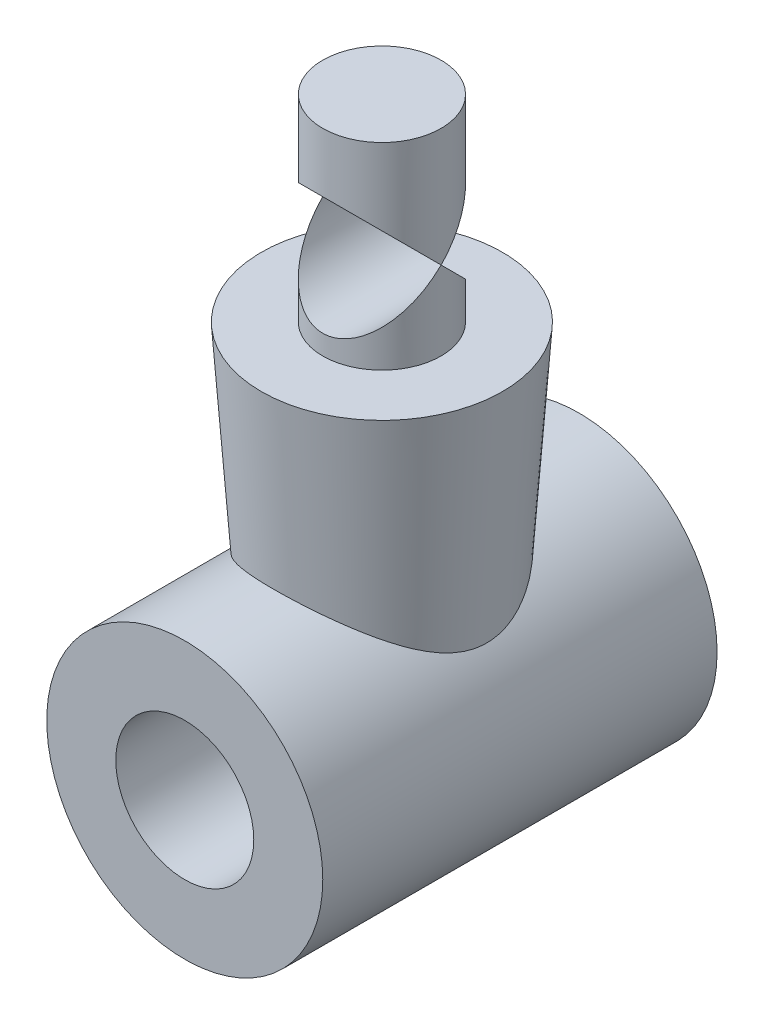
ISO-10303-21;
HEADER;
FILE_DESCRIPTION(('STEP AP214'),'2;1');
FILE_NAME('part.step','',(''),(''),'','','');
FILE_SCHEMA(('AUTOMOTIVE_DESIGN { 1 0 10303 214 1 1 1 1 }'));
ENDSEC;
DATA;
#1=APPLICATION_CONTEXT('core data for automotive mechanical design processes');
#2=APPLICATION_PROTOCOL_DEFINITION('international standard','automotive_design',2000,#1);
#3=PRODUCT_CONTEXT('',#1,'mechanical');
#4=PRODUCT('Part','Part','',(#3));
#5=PRODUCT_RELATED_PRODUCT_CATEGORY('part','',(#4));
#6=PRODUCT_DEFINITION_FORMATION('','',#4);
#7=PRODUCT_DEFINITION_CONTEXT('part definition',#1,'design');
#8=PRODUCT_DEFINITION('design','',#6,#7);
#9=PRODUCT_DEFINITION_SHAPE('','',#8);
#10=(LENGTH_UNIT() NAMED_UNIT(*) SI_UNIT(.MILLI.,.METRE.));
#11=(NAMED_UNIT(*) PLANE_ANGLE_UNIT() SI_UNIT($,.RADIAN.));
#12=(NAMED_UNIT(*) SI_UNIT($,.STERADIAN.) SOLID_ANGLE_UNIT());
#13=UNCERTAINTY_MEASURE_WITH_UNIT(LENGTH_MEASURE(1.E-05),#10,'distance_accuracy_value','');
#14=(GEOMETRIC_REPRESENTATION_CONTEXT(3) GLOBAL_UNCERTAINTY_ASSIGNED_CONTEXT((#13)) GLOBAL_UNIT_ASSIGNED_CONTEXT((#10,
#11,#12)) REPRESENTATION_CONTEXT('',''));
#15=CARTESIAN_POINT('',(0.,0.,0.));
#16=DIRECTION('',(0.,0.,1.));
#17=DIRECTION('',(1.,0.,0.));
#18=AXIS2_PLACEMENT_3D('',#15,#16,#17);
#19=CARTESIAN_POINT('',(0.,80.,0.));
#20=DIRECTION('',(0.,1.,0.));
#21=DIRECTION('',(0.,0.,1.));
#22=AXIS2_PLACEMENT_3D('',#19,#20,#21);
#23=PLANE('',#22);
#24=CARTESIAN_POINT('',(0.,80.,0.));
#25=DIRECTION('',(0.,1.,0.));
#26=DIRECTION('',(0.,0.,1.));
#27=AXIS2_PLACEMENT_3D('',#24,#25,#26);
#28=CIRCLE('',#27,30.5941449554808);
#29=CARTESIAN_POINT('',(0.,80.,30.5941449554808));
#30=VERTEX_POINT('',#29);
#31=EDGE_CURVE('E164',#30,#30,#28,.T.);
#32=ORIENTED_EDGE('',*,*,#31,.T.);
#33=EDGE_LOOP('',(#32));
#34=FACE_BOUND('',#33,.T.);
#35=CARTESIAN_POINT('',(0.,80.,0.));
#36=DIRECTION('',(0.,1.,0.));
#37=DIRECTION('',(0.,0.,1.));
#38=AXIS2_PLACEMENT_3D('',#35,#36,#37);
#39=CIRCLE('',#38,15.);
#40=CARTESIAN_POINT('',(0.,80.,15.));
#41=VERTEX_POINT('',#40);
#42=EDGE_CURVE('E54',#41,#41,#39,.T.);
#43=ORIENTED_EDGE('',*,*,#42,.F.);
#44=EDGE_LOOP('',(#43));
#45=FACE_BOUND('',#44,.T.);
#46=ADVANCED_FACE('F45',(#34,#45),#23,.T.);
#47=CARTESIAN_POINT('',(0.,0.,50.));
#48=DIRECTION('',(0.,0.,-1.));
#49=DIRECTION('',(-1.,0.,0.));
#50=AXIS2_PLACEMENT_3D('',#47,#48,#49);
#51=CYLINDRICAL_SURFACE('',#50,35.);
#52=CARTESIAN_POINT('',(0.,0.,-50.));
#53=DIRECTION('',(0.,0.,1.));
#54=DIRECTION('',(1.,0.,0.));
#55=AXIS2_PLACEMENT_3D('',#52,#53,#54);
#56=CIRCLE('',#55,35.);
#57=CARTESIAN_POINT('',(35.,0.,-50.));
#58=VERTEX_POINT('',#57);
#59=EDGE_CURVE('E78',#58,#58,#56,.T.);
#60=ORIENTED_EDGE('',*,*,#59,.T.);
#61=EDGE_LOOP('',(#60));
#62=FACE_BOUND('',#61,.T.);
#63=CARTESIAN_POINT('',(0.,0.,50.));
#64=DIRECTION('',(0.,0.,1.));
#65=DIRECTION('',(1.,0.,0.));
#66=AXIS2_PLACEMENT_3D('',#63,#64,#65);
#67=CIRCLE('',#66,35.);
#68=CARTESIAN_POINT('',(35.,0.,50.));
#69=VERTEX_POINT('',#68);
#70=EDGE_CURVE('E159',#69,#69,#67,.T.);
#71=ORIENTED_EDGE('',*,*,#70,.F.);
#72=EDGE_LOOP('',(#71));
#73=FACE_BOUND('',#72,.T.);
#74=CARTESIAN_POINT('',(-26.5488905921841,22.8069377235139,-1.56226440722871));
#75=CARTESIAN_POINT('',(-26.5816020897605,22.7688663300843,-0.960928684881653));
#76=CARTESIAN_POINT('',(-26.5954656096954,22.7526119888235,-0.357027043538421));
#77=CARTESIAN_POINT('',(-26.5851282481966,22.7646862271007,0.850093511749713));
#78=CARTESIAN_POINT('',(-26.5609167855964,22.7930271998288,1.45331218927284));
#79=CARTESIAN_POINT('',(-26.4749247824404,22.8928514611434,2.65426582080793));
#80=CARTESIAN_POINT('',(-26.4130924298845,22.9643942468295,3.25199205607547));
#81=CARTESIAN_POINT('',(-26.253118079118,23.1471040016381,4.43632547933198));
#82=CARTESIAN_POINT('',(-26.1549757324716,23.2582713510029,5.02293256056324));
#83=CARTESIAN_POINT('',(-25.9253569328635,23.5139314521459,6.17524217163166));
#84=CARTESIAN_POINT('',(-25.7942482506491,23.6580550361466,6.74110118639965));
#85=CARTESIAN_POINT('',(-25.4999126218233,23.9750118438686,7.85637565409192));
#86=CARTESIAN_POINT('',(-25.3366706445326,24.1478584971835,8.40578327261325));
#87=CARTESIAN_POINT('',(-24.9796294714977,24.5170153091067,9.48690126890832));
#88=CARTESIAN_POINT('',(-24.7858078305209,24.713342676562,10.0185982973177));
#89=CARTESIAN_POINT('',(-24.3691595705759,25.1242854753851,11.0629802848355));
#90=CARTESIAN_POINT('',(-24.146338494398,25.3388974092424,11.5756688531155));
#91=CARTESIAN_POINT('',(-23.5560218784384,25.8910753892501,12.8298234299394));
#92=CARTESIAN_POINT('',(-23.1713409786776,26.2371170285954,13.559532059302));
#93=CARTESIAN_POINT('',(-22.3422481191321,26.9466512458336,14.9753779970905));
#94=CARTESIAN_POINT('',(-21.8978134319206,27.3101504297433,15.6614985798129));
#95=CARTESIAN_POINT('',(-20.9499757601655,28.0438644424219,16.9900326365727));
#96=CARTESIAN_POINT('',(-20.4464731722283,28.4140896984342,17.6323693113153));
#97=CARTESIAN_POINT('',(-19.3820944383247,29.1505279248864,18.8699503871138));
#98=CARTESIAN_POINT('',(-18.8212261684914,29.516741438503,19.465201233062));
#99=CARTESIAN_POINT('',(-17.6379791682679,30.2388137522736,20.6102017667138));
#100=CARTESIAN_POINT('',(-17.0151407491039,30.5945651942643,21.1595456773575));
#101=CARTESIAN_POINT('',(-15.7127945216912,31.283397385232,22.2028508175188));
#102=CARTESIAN_POINT('',(-15.0332788555369,31.6164749789729,22.6968043452146));
#103=CARTESIAN_POINT('',(-13.6212794102822,32.2499191434123,23.6222905304459));
#104=CARTESIAN_POINT('',(-12.8889443728598,32.5503720281072,24.0539889398763));
#105=CARTESIAN_POINT('',(-11.7528310358784,32.9702011338961,24.6504416367821));
#106=CARTESIAN_POINT('',(-11.3679152275488,33.1049855822037,24.8407200812907));
#107=CARTESIAN_POINT('',(-10.5859419036558,33.3632636579013,25.2034856433234));
#108=CARTESIAN_POINT('',(-10.1888815548513,33.4867546233688,25.3759685675884));
#109=CARTESIAN_POINT('',(-9.23148735720225,33.765563109425,25.7637015778327));
#110=CARTESIAN_POINT('',(-8.6660754193532,33.9153085843781,25.9705329846434));
#111=CARTESIAN_POINT('',(-7.516667570741,34.1884272114192,26.3460592718158));
#112=CARTESIAN_POINT('',(-6.93267636941503,34.311806986402,26.5147637300372));
#113=CARTESIAN_POINT('',(-5.74953160924039,34.5297618593752,26.8117972236061));
#114=CARTESIAN_POINT('',(-5.1503861842534,34.6243520688281,26.9401474418135));
#115=CARTESIAN_POINT('',(-3.94053788771621,34.7828168657767,27.154704532018));
#116=CARTESIAN_POINT('',(-3.32983461068292,34.8466903735572,27.2409099225946));
#117=CARTESIAN_POINT('',(-2.09922167653956,34.9424588693151,27.3700259685334));
#118=CARTESIAN_POINT('',(-1.47928759834497,34.9742432380459,27.4127868630959));
#119=CARTESIAN_POINT('',(-0.23713202145856,35.0047100528464,27.4537769796077));
#120=CARTESIAN_POINT('',(0.38508946841538,35.0033926263885,27.4520063730443));
#121=CARTESIAN_POINT('',(1.62690190861612,34.9676863330345,27.4039628889949));
#122=CARTESIAN_POINT('',(2.24649262577538,34.9332945937511,27.3576861463081));
#123=CARTESIAN_POINT('',(3.47815390264036,34.8322300020338,27.221394718994));
#124=CARTESIAN_POINT('',(4.09022460391822,34.765557758272,27.131380859061));
#125=CARTESIAN_POINT('',(5.27214112778017,34.6055243075261,26.9146006884851));
#126=CARTESIAN_POINT('',(5.8425704691514,34.5136599042929,26.7898911024835));
#127=CARTESIAN_POINT('',(6.96925420632147,34.303904339761,26.5039512816503));
#128=CARTESIAN_POINT('',(7.52550918641018,34.1860142532247,26.3427225549144));
#129=CARTESIAN_POINT('',(8.62109998950039,33.9262974984167,25.9856606535141));
#130=CARTESIAN_POINT('',(9.16043363018557,33.7844677576144,25.7898230368263));
#131=CARTESIAN_POINT('',(10.219844942329,33.4792282637885,25.365642300928));
#132=CARTESIAN_POINT('',(10.7399214821734,33.3158172451429,25.1372972752777));
#133=CARTESIAN_POINT('',(11.8075092032836,32.9534515315464,24.6270480509801));
#134=CARTESIAN_POINT('',(12.3529262772655,32.7525945510773,24.3421155914244));
#135=CARTESIAN_POINT('',(13.4168197875949,32.3313526844835,23.7384845569979));
#136=CARTESIAN_POINT('',(13.9352948301803,32.1109667896835,23.4197842378388));
#137=CARTESIAN_POINT('',(14.9443214123162,31.6539747202828,22.7509562338535));
#138=CARTESIAN_POINT('',(15.4348624537116,31.4173625201944,22.4008168593339));
#139=CARTESIAN_POINT('',(16.387093987833,30.931359104639,21.671352252336));
#140=CARTESIAN_POINT('',(16.8487807040885,30.6819662241708,21.2920232139343));
#141=CARTESIAN_POINT('',(17.8319979494327,30.1230836137938,20.4275969597361));
#142=CARTESIAN_POINT('',(18.3470896593566,29.8115312261286,19.9364972676433));
#143=CARTESIAN_POINT('',(19.3344811003469,29.1808345944454,18.9174713689146));
#144=CARTESIAN_POINT('',(19.8067743664586,28.8616892126236,18.3895396198281));
#145=CARTESIAN_POINT('',(20.7085295402389,28.2216721950469,17.2981224950263));
#146=CARTESIAN_POINT('',(21.1379446854277,27.9007990682834,16.7345993734863));
#147=CARTESIAN_POINT('',(21.9526968924284,27.2643766175647,15.5737523812348));
#148=CARTESIAN_POINT('',(22.3380377277558,26.9488268398147,14.976431410753));
#149=CARTESIAN_POINT('',(23.0427182762159,26.3483376190507,13.7841065976734));
#150=CARTESIAN_POINT('',(23.3645831087234,26.0626824534211,13.1909569878838));
#151=CARTESIAN_POINT('',(23.9670048314338,25.5097984171693,11.9756099991335));
#152=CARTESIAN_POINT('',(24.2475585456724,25.242570964093,11.3534103916713));
#153=CARTESIAN_POINT('',(24.7649607156255,24.735153633259,10.0817187142233));
#154=CARTESIAN_POINT('',(25.0018814873965,24.494919280342,9.43227403393749));
#155=CARTESIAN_POINT('',(25.42996949755,24.0501979421391,8.10660505889992));
#156=CARTESIAN_POINT('',(25.6211527274156,23.8456984694201,7.43039022061416));
#157=CARTESIAN_POINT('',(25.9144988724654,23.5260244234644,6.22003344428528));
#158=CARTESIAN_POINT('',(26.0270113987683,23.4012005888792,5.69093721675198));
#159=CARTESIAN_POINT('',(26.2225201112894,23.1819128426803,4.62109600466539));
#160=CARTESIAN_POINT('',(26.3055203929164,23.0874447187855,4.08035264743624));
#161=CARTESIAN_POINT('',(26.4406248655514,22.9325961351776,2.9909543752883));
#162=CARTESIAN_POINT('',(26.4927741318528,22.8721659500908,2.44231220846444));
#163=CARTESIAN_POINT('',(26.5654277869376,22.7877421680704,1.34010668024048));
#164=CARTESIAN_POINT('',(26.585932167997,22.7637485800304,0.786543317639217));
#165=CARTESIAN_POINT('',(26.5949029697388,22.7532677335835,-0.322478244166155));
#166=CARTESIAN_POINT('',(26.5832955858934,22.7668668769053,-0.877937872966779));
#167=CARTESIAN_POINT('',(26.5281168752673,22.8311360030133,-1.98507493957895));
#168=CARTESIAN_POINT('',(26.484545632886,22.8818058879156,-2.53675238737332));
#169=CARTESIAN_POINT('',(26.366166044469,23.0181099620939,-3.63313495128082));
#170=CARTESIAN_POINT('',(26.2913132051506,23.1037939497065,-4.17782899264996));
#171=CARTESIAN_POINT('',(26.1115908824039,23.3067182559876,-5.25624676574789));
#172=CARTESIAN_POINT('',(26.0067172117684,23.4239629765076,-5.78996895602097));
#173=CARTESIAN_POINT('',(25.7326855233964,23.7251303458319,-7.00178524929069));
#174=CARTESIAN_POINT('',(25.5536821303306,23.9185075315634,-7.67531257056482));
#175=CARTESIAN_POINT('',(25.1504071045667,24.3421942325363,-8.9966924603244));
#176=CARTESIAN_POINT('',(24.9261198559698,24.5725164824418,-9.64453607946867));
#177=CARTESIAN_POINT('',(24.4345412746036,25.061394636045,-10.9138027397813));
#178=CARTESIAN_POINT('',(24.1671852591999,25.3199928151676,-11.5351842358192));
#179=CARTESIAN_POINT('',(23.5917451979425,25.8569996881149,-12.7497009201412));
#180=CARTESIAN_POINT('',(23.2836642804603,26.1354068595113,-13.3428382733048));
#181=CARTESIAN_POINT('',(22.6176484073696,26.7140934955255,-14.5190908397184));
#182=CARTESIAN_POINT('',(22.2584312915485,27.0147880933939,-15.1012742941847));
#183=CARTESIAN_POINT('',(21.4991105947089,27.6229051970081,-16.2346282171002));
#184=CARTESIAN_POINT('',(21.0990057987384,27.9303279024622,-16.7857977632354));
#185=CARTESIAN_POINT('',(20.2587251210192,28.5456678230878,-17.855980470573));
#186=CARTESIAN_POINT('',(19.818565476668,28.8535847886068,-18.3750065199443));
#187=CARTESIAN_POINT('',(18.8984872122875,29.4644212737518,-19.3797160469034));
#188=CARTESIAN_POINT('',(18.4185689223488,29.767340834843,-19.8653998012498));
#189=CARTESIAN_POINT('',(17.4059015019265,30.3708962921395,-20.8140731203175));
#190=CARTESIAN_POINT('',(16.8720760523137,30.6712498762944,-21.2760963384346));
#191=CARTESIAN_POINT('',(15.7635779892309,31.2554332682383,-22.1600573091798));
#192=CARTESIAN_POINT('',(15.1889029715765,31.5392621016787,-22.5819926990348));
#193=CARTESIAN_POINT('',(14.0003051378863,32.0845552169558,-23.3819594546026));
#194=CARTESIAN_POINT('',(13.3864094123889,32.3460346502782,-23.7600206274823));
#195=CARTESIAN_POINT('',(12.1210101237122,32.8411692222844,-24.4684283031352));
#196=CARTESIAN_POINT('',(11.4695144431259,33.0748301617053,-24.798784756409));
#197=CARTESIAN_POINT('',(10.2488683075799,33.4708450632298,-25.3541258452596));
#198=CARTESIAN_POINT('',(9.68522328346674,33.6385244720381,-25.5874359134132));
#199=CARTESIAN_POINT('',(8.53675060519238,33.9481581483638,-26.0159362070456));
#200=CARTESIAN_POINT('',(7.95192513258562,34.0901150562698,-26.2111303452458));
#201=CARTESIAN_POINT('',(6.76446432805265,34.3454596218628,-26.5608022641972));
#202=CARTESIAN_POINT('',(6.16183917794292,34.4588632721127,-26.7153028394914));
#203=CARTESIAN_POINT('',(4.94222778097024,34.6548090147215,-26.9814985914549));
#204=CARTESIAN_POINT('',(4.32524137781331,34.7373507710426,-27.0931933020354));
#205=CARTESIAN_POINT('',(3.07858138254592,34.8700009656242,-27.2723952146825));
#206=CARTESIAN_POINT('',(2.44886368349186,34.9199640539143,-27.3397044053007));
#207=CARTESIAN_POINT('',(1.18440093591247,34.9856822717258,-27.4281927432573));
#208=CARTESIAN_POINT('',(0.549655875877318,35.0014373229073,-27.4493717849532));
#209=CARTESIAN_POINT('',(-0.719568302240259,34.9983564608403,-27.4452276710844));
#210=CARTESIAN_POINT('',(-1.35404743018012,34.9795219691632,-27.4199064266024));
#211=CARTESIAN_POINT('',(-2.6175080073499,34.9077211257584,-27.323208663417));
#212=CARTESIAN_POINT('',(-3.24648966632099,34.8547560820025,-27.2518339096041));
#213=CARTESIAN_POINT('',(-4.45042502213632,34.7208100519249,-27.0708071009165));
#214=CARTESIAN_POINT('',(-5.02608506264237,34.6420430289877,-26.9641750910477));
#215=CARTESIAN_POINT('',(-6.16478004279023,34.4576280135958,-26.7136038909342));
#216=CARTESIAN_POINT('',(-6.72781569211197,34.3519815363124,-26.5696668035357));
#217=CARTESIAN_POINT('',(-7.83829978709834,34.1157355271264,-26.2462734804761));
#218=CARTESIAN_POINT('',(-8.38574541009199,33.9851315090977,-26.0668108588803));
#219=CARTESIAN_POINT('',(-9.4624293739641,33.7012235182312,-25.6744097432088));
#220=CARTESIAN_POINT('',(-9.99166665349024,33.5479182249042,-25.4614693017488));
#221=CARTESIAN_POINT('',(-11.0700469715899,33.2083997294529,-24.9865489091726));
#222=CARTESIAN_POINT('',(-11.6175671296448,33.0205589012058,-24.7220507802968));
#223=CARTESIAN_POINT('',(-12.6872372134788,32.6245207761673,-24.1592638871084));
#224=CARTESIAN_POINT('',(-13.2093861575955,32.4163226926508,-23.8609738168041));
#225=CARTESIAN_POINT('',(-14.2269575898941,31.9828002964855,-23.2330663230465));
#226=CARTESIAN_POINT('',(-14.7223815393082,31.7574769218157,-22.9034506151002));
#227=CARTESIAN_POINT('',(-15.6856964326028,31.2928901990526,-22.2150423583723));
#228=CARTESIAN_POINT('',(-16.1535833300471,31.0536248124773,-21.8562455399273));
#229=CARTESIAN_POINT('',(-17.1481428474737,30.5175109275853,-21.0400491357108));
#230=CARTESIAN_POINT('',(-17.6689124576775,30.2184102320418,-20.5769256547329));
#231=CARTESIAN_POINT('',(-18.6698637787223,29.6104568946658,-19.61462066525));
#232=CARTESIAN_POINT('',(-19.150040937742,29.3016031644997,-19.1154351245464));
#233=CARTESIAN_POINT('',(-20.070589439295,28.6789293849691,-18.081602997415));
#234=CARTESIAN_POINT('',(-20.5108490884327,28.3650981223895,-17.5468637512289));
#235=CARTESIAN_POINT('',(-21.3495875020818,27.7393032065627,-16.4445403661447));
#236=CARTESIAN_POINT('',(-21.7480646832621,27.4273396245127,-15.8769549838183));
#237=CARTESIAN_POINT('',(-22.5728739457443,26.7544151207659,-14.6009325819323));
#238=CARTESIAN_POINT('',(-22.99055160463,26.3951610947339,-13.8859624290604));
#239=CARTESIAN_POINT('',(-23.7641527060033,25.7008812202643,-12.4115552240225));
#240=CARTESIAN_POINT('',(-24.1200487386867,25.3658661638426,-11.6520986339934));
#241=CARTESIAN_POINT('',(-24.7650313473991,24.7365184992145,-10.0935555809752));
#242=CARTESIAN_POINT('',(-25.0544176303596,24.4420058914471,-9.29466742254534));
#243=CARTESIAN_POINT('',(-25.5633471054844,23.9092287606385,-7.65756394885426));
#244=CARTESIAN_POINT('',(-25.782977377062,23.6708942047834,-6.81939917695627));
#245=CARTESIAN_POINT('',(-26.1170540138489,23.3013163716932,-5.24948422878493));
#246=CARTESIAN_POINT('',(-26.2428454802296,23.1589185247911,-4.52283610541396));
#247=CARTESIAN_POINT('',(-26.3895369639053,22.9912517977678,-3.42052279160714));
#248=CARTESIAN_POINT('',(-26.4314370546112,22.943015217297,-3.05098832666767));
#249=CARTESIAN_POINT('',(-26.5009508253775,22.8626865384255,-2.3087216189123));
#250=CARTESIAN_POINT('',(-26.5285607229752,22.8305987144916,-1.93598855597412));
#251=CARTESIAN_POINT('',(-26.5488905921841,22.8069377235139,-1.56226440722871));
#252=B_SPLINE_CURVE_WITH_KNOTS('',3,(#74,#75,#76,#77,#78,#79,#80,#81,#82,#83,#84,#85,#86,#87,
#88,#89,#90,#91,#92,#93,#94,#95,#96,#97,#98,#99,#100,#101,#102,#103,#104,#105,#106,#107,#108,
#109,#110,#111,#112,#113,#114,#115,#116,#117,#118,#119,#120,#121,#122,#123,#124,#125,#126,#127,
#128,#129,#130,#131,#132,#133,#134,#135,#136,#137,#138,#139,#140,#141,#142,#143,#144,#145,#146,
#147,#148,#149,#150,#151,#152,#153,#154,#155,#156,#157,#158,#159,#160,#161,#162,#163,#164,#165,
#166,#167,#168,#169,#170,#171,#172,#173,#174,#175,#176,#177,#178,#179,#180,#181,#182,#183,#184,
#185,#186,#187,#188,#189,#190,#191,#192,#193,#194,#195,#196,#197,#198,#199,#200,#201,#202,#203,
#204,#205,#206,#207,#208,#209,#210,#211,#212,#213,#214,#215,#216,#217,#218,#219,#220,#221,#222,
#223,#224,#225,#226,#227,#228,#229,#230,#231,#232,#233,#234,#235,#236,#237,#238,#239,#240,#241,
#242,#243,#244,#245,#246,#247,#248,#249,#250,#251),.UNSPECIFIED.,.T.,.F.,(4,2,2,2,2,2,2,2,2,2,2,
2,2,2,2,2,2,2,2,2,2,2,2,2,2,2,2,2,2,2,2,2,2,2,2,2,2,2,2,2,2,2,2,2,2,2,2,2,2,2,2,2,2,2,2,2,2,2,2,
2,2,2,2,2,2,2,2,2,2,2,2,2,2,2,2,2,2,2,2,2,2,2,2,2,2,2,2,2,4),(0.,1.8098320160308,
3.6201670793949,5.43300102211055,7.24585236147776,9.03931338007425,10.833615310593,
12.6292404246862,14.4245228356563,17.1044654888185,19.7854303604093,22.4709828169244,
25.1561670489828,27.8630118036951,30.5702324693842,33.2701066438809,34.6196620229754,
35.9695346826128,37.8287277750356,39.6874532996689,41.5452015016388,43.4030150000852,
45.2672111981545,47.1314002173487,48.9957511493966,50.8600669291438,52.6314087129183,
54.402677360638,56.1741735146008,57.9457736031255,59.885842060459,61.8260107814791,
63.7669039086796,65.7080505313803,68.036493566056,70.365287741369,72.69659455712,
75.0277016234436,77.2243291380971,79.4211254395685,81.6142474044241,83.8066014509382,
85.4704784157284,87.1341243944197,88.7953336387758,90.4565432886075,92.121574173044,
93.7866006610414,95.454003498318,97.1216390128914,99.2880757643206,101.455260879995,
103.625731648638,105.796035784651,108.035955838902,110.275942470346,112.515025069079,
114.754089080008,117.053586764842,119.353219897888,121.651281450202,123.948862966242,
125.844939441619,127.740821176281,129.635638661288,131.530476777304,133.433711911307,
135.336951403904,137.240112678351,139.143201023028,140.913432154286,142.683563521262,
144.454013369731,146.224566242311,148.131961386916,150.039430273739,151.946794760694,
153.854438829403,156.127428583989,158.400672882386,160.680093386253,162.95960023672,
165.66403553139,168.369667616148,171.06285744745,173.752671918579,176.001184999722,
177.125680041558,178.250472573296),.UNSPECIFIED.);
#253=CARTESIAN_POINT('',(-26.5488905921841,22.8069377235139,-1.56226440722871));
#254=VERTEX_POINT('',#253);
#255=EDGE_CURVE('E64',#254,#254,#252,.T.);
#256=ORIENTED_EDGE('',*,*,#255,.F.);
#257=EDGE_LOOP('',(#256));
#258=FACE_BOUND('',#257,.T.);
#259=ADVANCED_FACE('F80',(#62,#73,#258),#51,.T.);
#260=CARTESIAN_POINT('',(0.,0.,50.));
#261=DIRECTION('',(0.,0.,1.));
#262=DIRECTION('',(1.,0.,0.));
#263=AXIS2_PLACEMENT_3D('',#260,#261,#262);
#264=PLANE('',#263);
#265=CARTESIAN_POINT('',(0.,0.,50.));
#266=DIRECTION('',(0.,0.,1.));
#267=DIRECTION('',(1.,0.,0.));
#268=AXIS2_PLACEMENT_3D('',#265,#266,#267);
#269=CIRCLE('',#268,17.5);
#270=CARTESIAN_POINT('',(17.5,0.,50.));
#271=VERTEX_POINT('',#270);
#272=EDGE_CURVE('E12',#271,#271,#269,.T.);
#273=ORIENTED_EDGE('',*,*,#272,.F.);
#274=EDGE_LOOP('',(#273));
#275=FACE_BOUND('',#274,.T.);
#276=ORIENTED_EDGE('',*,*,#70,.T.);
#277=EDGE_LOOP('',(#276));
#278=FACE_BOUND('',#277,.T.);
#279=ADVANCED_FACE('F90',(#275,#278),#264,.T.);
#280=CARTESIAN_POINT('',(0.,0.,-50.));
#281=DIRECTION('',(0.,0.,1.));
#282=DIRECTION('',(1.,0.,0.));
#283=AXIS2_PLACEMENT_3D('',#280,#281,#282);
#284=PLANE('',#283);
#285=CARTESIAN_POINT('',(0.,0.,-50.));
#286=DIRECTION('',(0.,0.,1.));
#287=DIRECTION('',(1.,0.,0.));
#288=AXIS2_PLACEMENT_3D('',#285,#286,#287);
#289=CIRCLE('',#288,17.5);
#290=CARTESIAN_POINT('',(17.5,0.,-50.));
#291=VERTEX_POINT('',#290);
#292=EDGE_CURVE('E49',#291,#291,#289,.T.);
#293=ORIENTED_EDGE('',*,*,#292,.T.);
#294=EDGE_LOOP('',(#293));
#295=FACE_BOUND('',#294,.T.);
#296=ORIENTED_EDGE('',*,*,#59,.F.);
#297=EDGE_LOOP('',(#296));
#298=FACE_BOUND('',#297,.T.);
#299=ADVANCED_FACE('F88',(#295,#298),#284,.F.);
#300=CARTESIAN_POINT('',(0.,0.,0.));
#301=DIRECTION('',(0.,1.,0.));
#302=DIRECTION('',(0.,0.,1.));
#303=AXIS2_PLACEMENT_3D('',#300,#301,#302);
#304=CONICAL_SURFACE('',#303,25.,0.0698131700797732);
#305=ORIENTED_EDGE('',*,*,#31,.F.);
#306=EDGE_LOOP('',(#305));
#307=FACE_BOUND('',#306,.T.);
#308=ORIENTED_EDGE('',*,*,#255,.T.);
#309=EDGE_LOOP('',(#308));
#310=FACE_BOUND('',#309,.T.);
#311=ADVANCED_FACE('F83',(#307,#310),#304,.T.);
#312=CARTESIAN_POINT('',(0.,130.,0.));
#313=DIRECTION('',(0.,-1.,0.));
#314=DIRECTION('',(0.,0.,-1.));
#315=AXIS2_PLACEMENT_3D('',#312,#313,#314);
#316=CYLINDRICAL_SURFACE('',#315,15.);
#317=CARTESIAN_POINT('',(0.,100.,0.));
#318=DIRECTION('',(0.,-0.707106781186547,-0.707106781186547));
#319=DIRECTION('',(0.,-0.707106781186547,0.707106781186547));
#320=AXIS2_PLACEMENT_3D('',#317,#318,#319);
#321=ELLIPSE('',#320,21.2132034355964,15.);
#322=CARTESIAN_POINT('',(15.,100.,0.));
#323=VERTEX_POINT('',#322);
#324=CARTESIAN_POINT('',(-15.,100.,0.));
#325=VERTEX_POINT('',#324);
#326=EDGE_CURVE('E62',#323,#325,#321,.T.);
#327=ORIENTED_EDGE('',*,*,#326,.T.);
#328=CARTESIAN_POINT('',(0.,100.,0.));
#329=DIRECTION('',(0.,-0.707106781186547,0.707106781186547));
#330=DIRECTION('',(0.,-0.707106781186547,-0.707106781186547));
#331=AXIS2_PLACEMENT_3D('',#328,#329,#330);
#332=ELLIPSE('',#331,21.2132034355964,15.);
#333=EDGE_CURVE('E60',#325,#323,#332,.T.);
#334=ORIENTED_EDGE('',*,*,#333,.T.);
#335=EDGE_LOOP('',(#327,#334));
#336=FACE_BOUND('',#335,.T.);
#337=ORIENTED_EDGE('',*,*,#42,.T.);
#338=EDGE_LOOP('',(#337));
#339=FACE_BOUND('',#338,.T.);
#340=ADVANCED_FACE('F66',(#336,#339),#316,.T.);
#341=CARTESIAN_POINT('',(0.,0.,-50.));
#342=DIRECTION('',(0.,0.,1.));
#343=DIRECTION('',(1.,0.,0.));
#344=AXIS2_PLACEMENT_3D('',#341,#342,#343);
#345=CYLINDRICAL_SURFACE('',#344,17.5);
#346=ORIENTED_EDGE('',*,*,#292,.F.);
#347=EDGE_LOOP('',(#346));
#348=FACE_BOUND('',#347,.T.);
#349=ORIENTED_EDGE('',*,*,#272,.T.);
#350=EDGE_LOOP('',(#349));
#351=FACE_BOUND('',#350,.T.);
#352=ADVANCED_FACE('F94',(#348,#351),#345,.F.);
#353=CARTESIAN_POINT('',(0.,100.,-50.));
#354=DIRECTION('',(0.,0.,1.));
#355=DIRECTION('',(1.,0.,0.));
#356=AXIS2_PLACEMENT_3D('',#353,#354,#355);
#357=CYLINDRICAL_SURFACE('',#356,15.);
#358=ORIENTED_EDGE('',*,*,#326,.F.);
#359=ORIENTED_EDGE('',*,*,#333,.F.);
#360=EDGE_LOOP('',(#358,#359));
#361=FACE_BOUND('',#360,.T.);
#362=ADVANCED_FACE('F47',(#361),#357,.F.);
#363=CLOSED_SHELL('',(#46,#259,#279,#299,#311,#340,#352,#362));
#364=MANIFOLD_SOLID_BREP('B2',#363);
#365=CARTESIAN_POINT('',(0.,130.,0.));
#366=DIRECTION('',(0.,1.,0.));
#367=DIRECTION('',(0.,0.,1.));
#368=AXIS2_PLACEMENT_3D('',#365,#366,#367);
#369=PLANE('',#368);
#370=CARTESIAN_POINT('',(0.,130.,0.));
#371=DIRECTION('',(0.,1.,0.));
#372=DIRECTION('',(0.,0.,1.));
#373=AXIS2_PLACEMENT_3D('',#370,#371,#372);
#374=CIRCLE('',#373,15.);
#375=CARTESIAN_POINT('',(0.,130.,15.));
#376=VERTEX_POINT('',#375);
#377=EDGE_CURVE('E193',#376,#376,#374,.T.);
#378=ORIENTED_EDGE('',*,*,#377,.T.);
#379=EDGE_LOOP('',(#378));
#380=FACE_BOUND('',#379,.T.);
#381=ADVANCED_FACE('F177',(#380),#369,.T.);
#382=CARTESIAN_POINT('',(0.,130.,0.));
#383=DIRECTION('',(0.,-1.,0.));
#384=DIRECTION('',(0.,0.,-1.));
#385=AXIS2_PLACEMENT_3D('',#382,#383,#384);
#386=CYLINDRICAL_SURFACE('',#385,15.);
#387=ORIENTED_EDGE('',*,*,#377,.F.);
#388=EDGE_LOOP('',(#387));
#389=FACE_BOUND('',#388,.T.);
#390=CARTESIAN_POINT('',(0.,100.,0.));
#391=DIRECTION('',(0.,-0.707106781186547,-0.707106781186547));
#392=DIRECTION('',(0.,-0.707106781186547,0.707106781186547));
#393=AXIS2_PLACEMENT_3D('',#390,#391,#392);
#394=ELLIPSE('',#393,21.2132034355964,15.);
#395=CARTESIAN_POINT('',(15.,100.,0.));
#396=VERTEX_POINT('',#395);
#397=CARTESIAN_POINT('',(-15.,100.,0.));
#398=VERTEX_POINT('',#397);
#399=EDGE_CURVE('E185',#396,#398,#394,.F.);
#400=ORIENTED_EDGE('',*,*,#399,.T.);
#401=CARTESIAN_POINT('',(0.,100.,0.));
#402=DIRECTION('',(0.,-0.707106781186547,0.707106781186547));
#403=DIRECTION('',(0.,-0.707106781186547,-0.707106781186547));
#404=AXIS2_PLACEMENT_3D('',#401,#402,#403);
#405=ELLIPSE('',#404,21.2132034355964,15.);
#406=EDGE_CURVE('E43',#398,#396,#405,.F.);
#407=ORIENTED_EDGE('',*,*,#406,.T.);
#408=EDGE_LOOP('',(#400,#407));
#409=FACE_BOUND('',#408,.T.);
#410=ADVANCED_FACE('F179',(#389,#409),#386,.T.);
#411=CARTESIAN_POINT('',(0.,100.,-50.));
#412=DIRECTION('',(0.,0.,1.));
#413=DIRECTION('',(1.,0.,0.));
#414=AXIS2_PLACEMENT_3D('',#411,#412,#413);
#415=CYLINDRICAL_SURFACE('',#414,15.);
#416=ORIENTED_EDGE('',*,*,#399,.F.);
#417=ORIENTED_EDGE('',*,*,#406,.F.);
#418=EDGE_LOOP('',(#416,#417));
#419=FACE_BOUND('',#418,.T.);
#420=ADVANCED_FACE('F191',(#419),#415,.F.);
#421=CLOSED_SHELL('',(#381,#410,#420));
#422=MANIFOLD_SOLID_BREP('B6',#421);
#423=ADVANCED_BREP_SHAPE_REPRESENTATION('',(#18,#364,#422),#14);
#424=SHAPE_DEFINITION_REPRESENTATION(#9,#423);
ENDSEC;
END-ISO-10303-21;
